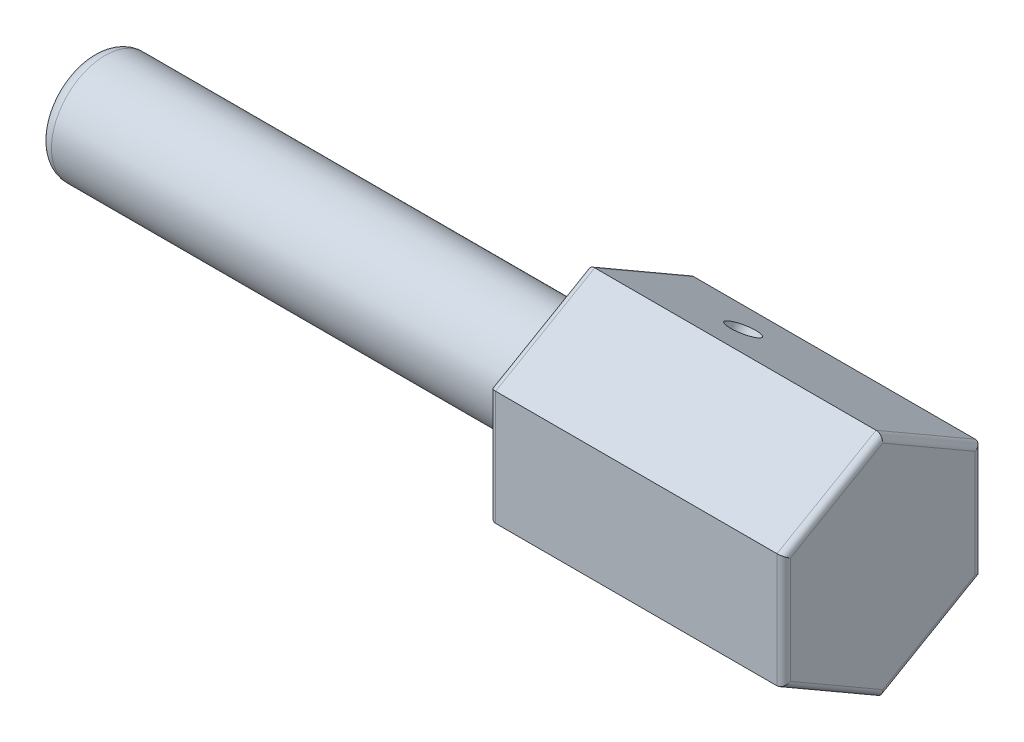
ISO-10303-21;
HEADER;
FILE_DESCRIPTION(('STEP AP214'),'2;1');
FILE_NAME('part.step','',(''),(''),'','','');
FILE_SCHEMA(('AUTOMOTIVE_DESIGN { 1 0 10303 214 1 1 1 1 }'));
ENDSEC;
DATA;
#1=APPLICATION_CONTEXT('core data for automotive mechanical design processes');
#2=APPLICATION_PROTOCOL_DEFINITION('international standard','automotive_design',2000,#1);
#3=PRODUCT_CONTEXT('',#1,'mechanical');
#4=PRODUCT('Part','Part','',(#3));
#5=PRODUCT_RELATED_PRODUCT_CATEGORY('part','',(#4));
#6=PRODUCT_DEFINITION_FORMATION('','',#4);
#7=PRODUCT_DEFINITION_CONTEXT('part definition',#1,'design');
#8=PRODUCT_DEFINITION('design','',#6,#7);
#9=PRODUCT_DEFINITION_SHAPE('','',#8);
#10=(LENGTH_UNIT() NAMED_UNIT(*) SI_UNIT(.MILLI.,.METRE.));
#11=(NAMED_UNIT(*) PLANE_ANGLE_UNIT() SI_UNIT($,.RADIAN.));
#12=(NAMED_UNIT(*) SI_UNIT($,.STERADIAN.) SOLID_ANGLE_UNIT());
#13=UNCERTAINTY_MEASURE_WITH_UNIT(LENGTH_MEASURE(1.E-05),#10,'distance_accuracy_value','');
#14=(GEOMETRIC_REPRESENTATION_CONTEXT(3) GLOBAL_UNCERTAINTY_ASSIGNED_CONTEXT((#13)) GLOBAL_UNIT_ASSIGNED_CONTEXT((#10,
#11,#12)) REPRESENTATION_CONTEXT('',''));
#15=CARTESIAN_POINT('',(0.,0.,0.));
#16=DIRECTION('',(0.,0.,1.));
#17=DIRECTION('',(1.,0.,0.));
#18=AXIS2_PLACEMENT_3D('',#15,#16,#17);
#19=CARTESIAN_POINT('',(37.05,0.,0.));
#20=DIRECTION('',(-1.,0.,0.));
#21=DIRECTION('',(0.,0.,1.));
#22=AXIS2_PLACEMENT_3D('',#19,#20,#21);
#23=CYLINDRICAL_SURFACE('',#22,4.);
#24=CARTESIAN_POINT('',(1.,0.,0.));
#25=DIRECTION('',(1.,0.,0.));
#26=DIRECTION('',(0.,0.,-1.));
#27=AXIS2_PLACEMENT_3D('',#24,#25,#26);
#28=CIRCLE('',#27,4.);
#29=CARTESIAN_POINT('',(1.,0.,-4.));
#30=VERTEX_POINT('',#29);
#31=EDGE_CURVE('E51',#30,#30,#28,.T.);
#32=ORIENTED_EDGE('',*,*,#31,.T.);
#33=EDGE_LOOP('',(#32));
#34=FACE_BOUND('',#33,.T.);
#35=CARTESIAN_POINT('',(36.55,0.,0.));
#36=DIRECTION('',(1.,0.,0.));
#37=DIRECTION('',(0.,0.,-1.));
#38=AXIS2_PLACEMENT_3D('',#35,#36,#37);
#39=CIRCLE('',#38,4.);
#40=CARTESIAN_POINT('',(36.55,0.,-4.));
#41=VERTEX_POINT('',#40);
#42=EDGE_CURVE('E209',#41,#41,#39,.F.);
#43=ORIENTED_EDGE('',*,*,#42,.T.);
#44=EDGE_LOOP('',(#43));
#45=FACE_BOUND('',#44,.T.);
#46=ADVANCED_FACE('F43',(#34,#45),#23,.T.);
#47=CARTESIAN_POINT('',(0.,0.,0.));
#48=DIRECTION('',(1.,0.,0.));
#49=DIRECTION('',(0.,0.,-1.));
#50=AXIS2_PLACEMENT_3D('',#47,#48,#49);
#51=PLANE('',#50);
#52=CARTESIAN_POINT('',(0.,0.,0.));
#53=DIRECTION('',(1.,0.,0.));
#54=DIRECTION('',(0.,0.,-1.));
#55=AXIS2_PLACEMENT_3D('',#52,#53,#54);
#56=CIRCLE('',#55,3.);
#57=CARTESIAN_POINT('',(0.,0.,-3.));
#58=VERTEX_POINT('',#57);
#59=EDGE_CURVE('E11',#58,#58,#56,.F.);
#60=ORIENTED_EDGE('',*,*,#59,.T.);
#61=EDGE_LOOP('',(#60));
#62=FACE_BOUND('',#61,.T.);
#63=ADVANCED_FACE('F268',(#62),#51,.F.);
#64=CARTESIAN_POINT('',(59.05,-4.27239199200323,7.4));
#65=DIRECTION('',(0.,0.866025403784439,-0.5));
#66=DIRECTION('',(0.,0.5,0.866025403784438));
#67=AXIS2_PLACEMENT_3D('',#64,#65,#66);
#68=PLANE('',#67);
#69=CARTESIAN_POINT('',(44.925,-6.40858798800485,3.7));
#70=DIRECTION('',(0.,0.866025403784439,-0.5));
#71=DIRECTION('',(0.,0.5,0.866025403784438));
#72=AXIS2_PLACEMENT_3D('',#69,#70,#71);
#73=CIRCLE('',#72,1.1);
#74=CARTESIAN_POINT('',(44.925,-5.85858798800485,4.65262794416288));
#75=VERTEX_POINT('',#74);
#76=EDGE_CURVE('E241',#75,#75,#73,.T.);
#77=ORIENTED_EDGE('',*,*,#76,.T.);
#78=EDGE_LOOP('',(#77));
#79=FACE_BOUND('',#78,.T.);
#80=DIRECTION('',(-1.,0.,0.));
#81=VECTOR('',#80,1.);
#82=CARTESIAN_POINT('',(59.05,-4.27239199200323,7.4));
#83=LINE('',#82,#81);
#84=CARTESIAN_POINT('',(58.55,-4.27239199200323,7.4));
#85=VERTEX_POINT('',#84);
#86=CARTESIAN_POINT('',(37.55,-4.27239199200323,7.4));
#87=VERTEX_POINT('',#86);
#88=EDGE_CURVE('E237',#85,#87,#83,.T.);
#89=ORIENTED_EDGE('',*,*,#88,.T.);
#90=DIRECTION('',(0.,-0.5,-0.866025403784438));
#91=VECTOR('',#90,1.);
#92=CARTESIAN_POINT('',(37.55,-4.27239199200323,7.4));
#93=LINE('',#92,#91);
#94=CARTESIAN_POINT('',(37.55,-8.54478398400646,0.));
#95=VERTEX_POINT('',#94);
#96=EDGE_CURVE('E207',#87,#95,#93,.T.);
#97=ORIENTED_EDGE('',*,*,#96,.T.);
#98=DIRECTION('',(-1.,0.,0.));
#99=VECTOR('',#98,1.);
#100=CARTESIAN_POINT('',(59.05,-8.54478398400646,0.));
#101=LINE('',#100,#99);
#102=CARTESIAN_POINT('',(58.55,-8.54478398400646,0.));
#103=VERTEX_POINT('',#102);
#104=EDGE_CURVE('E155',#103,#95,#101,.T.);
#105=ORIENTED_EDGE('',*,*,#104,.F.);
#106=DIRECTION('',(0.,-0.5,-0.866025403784438));
#107=VECTOR('',#106,1.);
#108=CARTESIAN_POINT('',(58.55,-4.27239199200323,7.4));
#109=LINE('',#108,#107);
#110=EDGE_CURVE('E205',#103,#85,#109,.F.);
#111=ORIENTED_EDGE('',*,*,#110,.T.);
#112=EDGE_LOOP('',(#89,#97,#105,#111));
#113=FACE_BOUND('',#112,.T.);
#114=ADVANCED_FACE('F272',(#79,#113),#68,.F.);
#115=CARTESIAN_POINT('',(59.05,-8.54478398400646,0.));
#116=DIRECTION('',(0.,0.866025403784439,0.5));
#117=DIRECTION('',(0.,-0.5,0.866025403784439));
#118=AXIS2_PLACEMENT_3D('',#115,#116,#117);
#119=PLANE('',#118);
#120=ORIENTED_EDGE('',*,*,#104,.T.);
#121=DIRECTION('',(0.,0.5,-0.866025403784439));
#122=VECTOR('',#121,1.);
#123=CARTESIAN_POINT('',(37.55,-8.54478398400646,0.));
#124=LINE('',#123,#122);
#125=CARTESIAN_POINT('',(37.55,-4.27239199200323,-7.4));
#126=VERTEX_POINT('',#125);
#127=EDGE_CURVE('E154',#95,#126,#124,.T.);
#128=ORIENTED_EDGE('',*,*,#127,.T.);
#129=DIRECTION('',(-1.,0.,0.));
#130=VECTOR('',#129,1.);
#131=CARTESIAN_POINT('',(59.05,-4.27239199200323,-7.4));
#132=LINE('',#131,#130);
#133=CARTESIAN_POINT('',(58.55,-4.27239199200323,-7.4));
#134=VERTEX_POINT('',#133);
#135=EDGE_CURVE('E136',#134,#126,#132,.T.);
#136=ORIENTED_EDGE('',*,*,#135,.F.);
#137=DIRECTION('',(0.,0.5,-0.866025403784439));
#138=VECTOR('',#137,1.);
#139=CARTESIAN_POINT('',(58.55,-8.54478398400646,0.));
#140=LINE('',#139,#138);
#141=EDGE_CURVE('E151',#134,#103,#140,.F.);
#142=ORIENTED_EDGE('',*,*,#141,.T.);
#143=EDGE_LOOP('',(#120,#128,#136,#142));
#144=FACE_BOUND('',#143,.T.);
#145=ADVANCED_FACE('F149',(#144),#119,.F.);
#146=CARTESIAN_POINT('',(59.05,-4.27239199200323,-7.4));
#147=DIRECTION('',(0.,0.,1.));
#148=DIRECTION('',(0.,-1.,0.));
#149=AXIS2_PLACEMENT_3D('',#146,#147,#148);
#150=PLANE('',#149);
#151=ORIENTED_EDGE('',*,*,#135,.T.);
#152=DIRECTION('',(0.,1.,0.));
#153=VECTOR('',#152,1.);
#154=CARTESIAN_POINT('',(37.55,-4.27239199200323,-7.4));
#155=LINE('',#154,#153);
#156=CARTESIAN_POINT('',(37.55,4.27239199200323,-7.4));
#157=VERTEX_POINT('',#156);
#158=EDGE_CURVE('E143',#126,#157,#155,.T.);
#159=ORIENTED_EDGE('',*,*,#158,.T.);
#160=DIRECTION('',(-1.,0.,0.));
#161=VECTOR('',#160,1.);
#162=CARTESIAN_POINT('',(59.05,4.27239199200323,-7.4));
#163=LINE('',#162,#161);
#164=CARTESIAN_POINT('',(58.55,4.27239199200323,-7.4));
#165=VERTEX_POINT('',#164);
#166=EDGE_CURVE('E138',#165,#157,#163,.T.);
#167=ORIENTED_EDGE('',*,*,#166,.F.);
#168=DIRECTION('',(0.,1.,0.));
#169=VECTOR('',#168,1.);
#170=CARTESIAN_POINT('',(58.55,-4.27239199200323,-7.4));
#171=LINE('',#170,#169);
#172=EDGE_CURVE('E133',#165,#134,#171,.F.);
#173=ORIENTED_EDGE('',*,*,#172,.T.);
#174=EDGE_LOOP('',(#151,#159,#167,#173));
#175=FACE_BOUND('',#174,.T.);
#176=ADVANCED_FACE('F135',(#175),#150,.F.);
#177=CARTESIAN_POINT('',(59.05,4.27239199200323,-7.4));
#178=DIRECTION('',(0.,-0.866025403784439,0.5));
#179=DIRECTION('',(0.,-0.5,-0.866025403784439));
#180=AXIS2_PLACEMENT_3D('',#177,#178,#179);
#181=PLANE('',#180);
#182=CARTESIAN_POINT('',(44.925,6.40858798800485,-3.7));
#183=DIRECTION('',(0.,0.866025403784439,-0.5));
#184=DIRECTION('',(0.,0.5,0.866025403784438));
#185=AXIS2_PLACEMENT_3D('',#182,#183,#184);
#186=CIRCLE('',#185,1.1);
#187=CARTESIAN_POINT('',(44.925,6.95858798800485,-2.74737205583712));
#188=VERTEX_POINT('',#187);
#189=EDGE_CURVE('E517',#188,#188,#186,.T.);
#190=ORIENTED_EDGE('',*,*,#189,.F.);
#191=EDGE_LOOP('',(#190));
#192=FACE_BOUND('',#191,.T.);
#193=ORIENTED_EDGE('',*,*,#166,.T.);
#194=DIRECTION('',(0.,0.5,0.866025403784439));
#195=VECTOR('',#194,1.);
#196=CARTESIAN_POINT('',(37.55,4.27239199200323,-7.4));
#197=LINE('',#196,#195);
#198=CARTESIAN_POINT('',(37.55,8.54478398400646,0.));
#199=VERTEX_POINT('',#198);
#200=EDGE_CURVE('E194',#157,#199,#197,.T.);
#201=ORIENTED_EDGE('',*,*,#200,.T.);
#202=DIRECTION('',(-1.,0.,0.));
#203=VECTOR('',#202,1.);
#204=CARTESIAN_POINT('',(59.05,8.54478398400646,0.));
#205=LINE('',#204,#203);
#206=CARTESIAN_POINT('',(58.55,8.54478398400646,0.));
#207=VERTEX_POINT('',#206);
#208=EDGE_CURVE('E498',#207,#199,#205,.T.);
#209=ORIENTED_EDGE('',*,*,#208,.F.);
#210=DIRECTION('',(0.,0.5,0.866025403784439));
#211=VECTOR('',#210,1.);
#212=CARTESIAN_POINT('',(58.55,4.27239199200323,-7.4));
#213=LINE('',#212,#211);
#214=EDGE_CURVE('E192',#207,#165,#213,.F.);
#215=ORIENTED_EDGE('',*,*,#214,.T.);
#216=EDGE_LOOP('',(#193,#201,#209,#215));
#217=FACE_BOUND('',#216,.T.);
#218=ADVANCED_FACE('F363',(#192,#217),#181,.F.);
#219=CARTESIAN_POINT('',(59.05,8.54478398400646,0.));
#220=DIRECTION('',(0.,-0.866025403784439,-0.5));
#221=DIRECTION('',(0.,0.5,-0.866025403784439));
#222=AXIS2_PLACEMENT_3D('',#219,#220,#221);
#223=PLANE('',#222);
#224=ORIENTED_EDGE('',*,*,#208,.T.);
#225=DIRECTION('',(0.,-0.5,0.866025403784439));
#226=VECTOR('',#225,1.);
#227=CARTESIAN_POINT('',(37.55,8.54478398400646,0.));
#228=LINE('',#227,#226);
#229=CARTESIAN_POINT('',(37.55,4.27239199200323,7.4));
#230=VERTEX_POINT('',#229);
#231=EDGE_CURVE('E198',#199,#230,#228,.T.);
#232=ORIENTED_EDGE('',*,*,#231,.T.);
#233=DIRECTION('',(-1.,0.,0.));
#234=VECTOR('',#233,1.);
#235=CARTESIAN_POINT('',(59.05,4.27239199200323,7.4));
#236=LINE('',#235,#234);
#237=CARTESIAN_POINT('',(58.55,4.27239199200323,7.4));
#238=VERTEX_POINT('',#237);
#239=EDGE_CURVE('E507',#238,#230,#236,.T.);
#240=ORIENTED_EDGE('',*,*,#239,.F.);
#241=DIRECTION('',(0.,-0.5,0.866025403784439));
#242=VECTOR('',#241,1.);
#243=CARTESIAN_POINT('',(58.55,8.54478398400646,0.));
#244=LINE('',#243,#242);
#245=EDGE_CURVE('E196',#238,#207,#244,.F.);
#246=ORIENTED_EDGE('',*,*,#245,.T.);
#247=EDGE_LOOP('',(#224,#232,#240,#246));
#248=FACE_BOUND('',#247,.T.);
#249=ADVANCED_FACE('F366',(#248),#223,.F.);
#250=CARTESIAN_POINT('',(59.05,4.27239199200323,7.4));
#251=DIRECTION('',(0.,0.,-1.));
#252=DIRECTION('',(-1.,0.,0.));
#253=AXIS2_PLACEMENT_3D('',#250,#251,#252);
#254=PLANE('',#253);
#255=ORIENTED_EDGE('',*,*,#239,.T.);
#256=DIRECTION('',(0.,-1.,0.));
#257=VECTOR('',#256,1.);
#258=CARTESIAN_POINT('',(37.55,4.27239199200323,7.4));
#259=LINE('',#258,#257);
#260=EDGE_CURVE('E203',#230,#87,#259,.T.);
#261=ORIENTED_EDGE('',*,*,#260,.T.);
#262=ORIENTED_EDGE('',*,*,#88,.F.);
#263=DIRECTION('',(0.,-1.,0.));
#264=VECTOR('',#263,1.);
#265=CARTESIAN_POINT('',(58.55,4.27239199200323,7.4));
#266=LINE('',#265,#264);
#267=EDGE_CURVE('E200',#85,#238,#266,.F.);
#268=ORIENTED_EDGE('',*,*,#267,.T.);
#269=EDGE_LOOP('',(#255,#261,#262,#268));
#270=FACE_BOUND('',#269,.T.);
#271=ADVANCED_FACE('F403',(#270),#254,.F.);
#272=CARTESIAN_POINT('',(59.05,0.,0.));
#273=DIRECTION('',(1.,0.,0.));
#274=DIRECTION('',(0.,0.,-1.));
#275=AXIS2_PLACEMENT_3D('',#272,#273,#274);
#276=PLANE('',#275);
#277=DIRECTION('',(0.,-0.5,0.866025403784439));
#278=VECTOR('',#277,1.);
#279=CARTESIAN_POINT('',(59.05,3.83937929011101,7.15));
#280=LINE('',#279,#278);
#281=CARTESIAN_POINT('',(59.05,7.96743371481684,0.));
#282=VERTEX_POINT('',#281);
#283=CARTESIAN_POINT('',(59.05,3.98371685740842,6.9));
#284=VERTEX_POINT('',#283);
#285=EDGE_CURVE('E58',#282,#284,#280,.T.);
#286=ORIENTED_EDGE('',*,*,#285,.T.);
#287=DIRECTION('',(0.,-1.,0.));
#288=VECTOR('',#287,1.);
#289=CARTESIAN_POINT('',(59.05,-4.27239199200323,6.9));
#290=LINE('',#289,#288);
#291=CARTESIAN_POINT('',(59.05,-3.98371685740842,6.9));
#292=VERTEX_POINT('',#291);
#293=EDGE_CURVE('E219',#284,#292,#290,.T.);
#294=ORIENTED_EDGE('',*,*,#293,.T.);
#295=DIRECTION('',(0.,-0.5,-0.866025403784438));
#296=VECTOR('',#295,1.);
#297=CARTESIAN_POINT('',(59.05,-8.11177128211425,-0.249999999999997));
#298=LINE('',#297,#296);
#299=CARTESIAN_POINT('',(59.05,-7.96743371481684,0.));
#300=VERTEX_POINT('',#299);
#301=EDGE_CURVE('E212',#292,#300,#298,.T.);
#302=ORIENTED_EDGE('',*,*,#301,.T.);
#303=DIRECTION('',(0.,0.5,-0.866025403784439));
#304=VECTOR('',#303,1.);
#305=CARTESIAN_POINT('',(59.05,-3.83937929011101,-7.15));
#306=LINE('',#305,#304);
#307=CARTESIAN_POINT('',(59.05,-3.98371685740842,-6.9));
#308=VERTEX_POINT('',#307);
#309=EDGE_CURVE('E214',#300,#308,#306,.T.);
#310=ORIENTED_EDGE('',*,*,#309,.T.);
#311=DIRECTION('',(0.,1.,0.));
#312=VECTOR('',#311,1.);
#313=CARTESIAN_POINT('',(59.05,4.27239199200323,-6.9));
#314=LINE('',#313,#312);
#315=CARTESIAN_POINT('',(59.05,3.98371685740842,-6.9));
#316=VERTEX_POINT('',#315);
#317=EDGE_CURVE('E161',#308,#316,#314,.T.);
#318=ORIENTED_EDGE('',*,*,#317,.T.);
#319=DIRECTION('',(0.,0.5,0.866025403784439));
#320=VECTOR('',#319,1.);
#321=CARTESIAN_POINT('',(59.05,8.11177128211425,0.249999999999998));
#322=LINE('',#321,#320);
#323=EDGE_CURVE('E63',#316,#282,#322,.T.);
#324=ORIENTED_EDGE('',*,*,#323,.T.);
#325=EDGE_LOOP('',(#286,#294,#302,#310,#318,#324));
#326=FACE_BOUND('',#325,.T.);
#327=ADVANCED_FACE('F412',(#326),#276,.T.);
#328=CARTESIAN_POINT('',(37.05,0.,0.));
#329=DIRECTION('',(1.,0.,0.));
#330=DIRECTION('',(0.,0.,-1.));
#331=AXIS2_PLACEMENT_3D('',#328,#329,#330);
#332=PLANE('',#331);
#333=DIRECTION('',(0.,1.,0.));
#334=VECTOR('',#333,1.);
#335=CARTESIAN_POINT('',(37.05,0.,-6.9));
#336=LINE('',#335,#334);
#337=CARTESIAN_POINT('',(37.05,3.98371685740842,-6.9));
#338=VERTEX_POINT('',#337);
#339=CARTESIAN_POINT('',(37.05,-3.98371685740842,-6.9));
#340=VERTEX_POINT('',#339);
#341=EDGE_CURVE('E187',#338,#340,#336,.F.);
#342=ORIENTED_EDGE('',*,*,#341,.T.);
#343=DIRECTION('',(0.,0.5,-0.866025403784439));
#344=VECTOR('',#343,1.);
#345=CARTESIAN_POINT('',(37.05,-5.97557528611263,-3.45));
#346=LINE('',#345,#344);
#347=CARTESIAN_POINT('',(37.05,-7.96743371481684,0.));
#348=VERTEX_POINT('',#347);
#349=EDGE_CURVE('E144',#340,#348,#346,.F.);
#350=ORIENTED_EDGE('',*,*,#349,.T.);
#351=DIRECTION('',(0.,-0.5,-0.866025403784438));
#352=VECTOR('',#351,1.);
#353=CARTESIAN_POINT('',(37.05,-5.97557528611263,3.45));
#354=LINE('',#353,#352);
#355=CARTESIAN_POINT('',(37.05,-3.98371685740842,6.9));
#356=VERTEX_POINT('',#355);
#357=EDGE_CURVE('E179',#348,#356,#354,.F.);
#358=ORIENTED_EDGE('',*,*,#357,.T.);
#359=DIRECTION('',(0.,-1.,0.));
#360=VECTOR('',#359,1.);
#361=CARTESIAN_POINT('',(37.05,0.,6.9));
#362=LINE('',#361,#360);
#363=CARTESIAN_POINT('',(37.05,3.98371685740842,6.9));
#364=VERTEX_POINT('',#363);
#365=EDGE_CURVE('E181',#356,#364,#362,.F.);
#366=ORIENTED_EDGE('',*,*,#365,.T.);
#367=DIRECTION('',(0.,-0.5,0.866025403784439));
#368=VECTOR('',#367,1.);
#369=CARTESIAN_POINT('',(37.05,5.97557528611263,3.45));
#370=LINE('',#369,#368);
#371=CARTESIAN_POINT('',(37.05,7.96743371481684,0.));
#372=VERTEX_POINT('',#371);
#373=EDGE_CURVE('E183',#364,#372,#370,.F.);
#374=ORIENTED_EDGE('',*,*,#373,.T.);
#375=DIRECTION('',(0.,0.5,0.866025403784439));
#376=VECTOR('',#375,1.);
#377=CARTESIAN_POINT('',(37.05,5.97557528611263,-3.45));
#378=LINE('',#377,#376);
#379=EDGE_CURVE('E185',#372,#338,#378,.F.);
#380=ORIENTED_EDGE('',*,*,#379,.T.);
#381=EDGE_LOOP('',(#342,#350,#358,#366,#374,#380));
#382=FACE_BOUND('',#381,.T.);
#383=CARTESIAN_POINT('',(37.05,0.,0.));
#384=DIRECTION('',(1.,0.,0.));
#385=DIRECTION('',(0.,0.,-1.));
#386=AXIS2_PLACEMENT_3D('',#383,#384,#385);
#387=CIRCLE('',#386,4.5);
#388=CARTESIAN_POINT('',(37.05,0.,-4.5));
#389=VERTEX_POINT('',#388);
#390=EDGE_CURVE('E173',#389,#389,#387,.T.);
#391=ORIENTED_EDGE('',*,*,#390,.T.);
#392=EDGE_LOOP('',(#391));
#393=FACE_BOUND('',#392,.T.);
#394=ADVANCED_FACE('F301',(#382,#393),#332,.F.);
#395=CARTESIAN_POINT('',(37.55,8.11177128211424,-0.250000000000002));
#396=DIRECTION('',(0.,-0.5,0.866025403784439));
#397=DIRECTION('',(0.,-0.866025403784439,-0.5));
#398=AXIS2_PLACEMENT_3D('',#395,#396,#397);
#399=CYLINDRICAL_SURFACE('',#398,0.5);
#400=CARTESIAN_POINT('',(37.55,7.96743371481684,0.));
#401=DIRECTION('',(0.,0.,1.));
#402=DIRECTION('',(0.,-1.,0.));
#403=AXIS2_PLACEMENT_3D('',#400,#401,#402);
#404=ELLIPSE('',#403,0.577350269189626,0.5);
#405=EDGE_CURVE('E231',#372,#199,#404,.F.);
#406=ORIENTED_EDGE('',*,*,#405,.F.);
#407=ORIENTED_EDGE('',*,*,#373,.F.);
#408=CARTESIAN_POINT('',(37.55,3.98371685740842,6.9));
#409=DIRECTION('',(0.,-0.866025403784439,0.5));
#410=DIRECTION('',(0.,-0.5,-0.866025403784439));
#411=AXIS2_PLACEMENT_3D('',#408,#409,#410);
#412=ELLIPSE('',#411,0.577350269189626,0.5);
#413=EDGE_CURVE('E234',#230,#364,#412,.T.);
#414=ORIENTED_EDGE('',*,*,#413,.F.);
#415=ORIENTED_EDGE('',*,*,#231,.F.);
#416=EDGE_LOOP('',(#406,#407,#414,#415));
#417=FACE_BOUND('',#416,.T.);
#418=ADVANCED_FACE('F297',(#417),#399,.T.);
#419=CARTESIAN_POINT('',(37.55,4.27239199200323,6.9));
#420=DIRECTION('',(0.,-1.,0.));
#421=DIRECTION('',(0.,0.,-1.));
#422=AXIS2_PLACEMENT_3D('',#419,#420,#421);
#423=CYLINDRICAL_SURFACE('',#422,0.5);
#424=ORIENTED_EDGE('',*,*,#413,.T.);
#425=ORIENTED_EDGE('',*,*,#365,.F.);
#426=CARTESIAN_POINT('',(37.55,-3.98371685740842,6.9));
#427=DIRECTION('',(0.,-0.866025403784439,-0.5));
#428=DIRECTION('',(0.,0.5,-0.866025403784439));
#429=AXIS2_PLACEMENT_3D('',#426,#427,#428);
#430=ELLIPSE('',#429,0.577350269189626,0.5);
#431=EDGE_CURVE('E228',#87,#356,#430,.T.);
#432=ORIENTED_EDGE('',*,*,#431,.F.);
#433=ORIENTED_EDGE('',*,*,#260,.F.);
#434=EDGE_LOOP('',(#424,#425,#432,#433));
#435=FACE_BOUND('',#434,.T.);
#436=ADVANCED_FACE('F293',(#435),#423,.T.);
#437=CARTESIAN_POINT('',(37.55,3.83937929011101,-7.15));
#438=DIRECTION('',(0.,0.5,0.866025403784439));
#439=DIRECTION('',(0.,-0.866025403784439,0.5));
#440=AXIS2_PLACEMENT_3D('',#437,#438,#439);
#441=CYLINDRICAL_SURFACE('',#440,0.5);
#442=ORIENTED_EDGE('',*,*,#405,.T.);
#443=ORIENTED_EDGE('',*,*,#200,.F.);
#444=CARTESIAN_POINT('',(37.55,3.98371685740842,-6.9));
#445=DIRECTION('',(0.,0.866025403784439,0.5));
#446=DIRECTION('',(0.,-0.5,0.866025403784439));
#447=AXIS2_PLACEMENT_3D('',#444,#445,#446);
#448=ELLIPSE('',#447,0.577350269189626,0.5);
#449=EDGE_CURVE('E225',#338,#157,#448,.F.);
#450=ORIENTED_EDGE('',*,*,#449,.F.);
#451=ORIENTED_EDGE('',*,*,#379,.F.);
#452=EDGE_LOOP('',(#442,#443,#450,#451));
#453=FACE_BOUND('',#452,.T.);
#454=ADVANCED_FACE('F289',(#453),#441,.T.);
#455=CARTESIAN_POINT('',(37.55,-3.83937929011101,7.15));
#456=DIRECTION('',(0.,-0.5,-0.866025403784438));
#457=DIRECTION('',(0.,0.866025403784439,-0.5));
#458=AXIS2_PLACEMENT_3D('',#455,#456,#457);
#459=CYLINDRICAL_SURFACE('',#458,0.5);
#460=ORIENTED_EDGE('',*,*,#431,.T.);
#461=ORIENTED_EDGE('',*,*,#357,.F.);
#462=CARTESIAN_POINT('',(37.55,-7.96743371481684,0.));
#463=DIRECTION('',(0.,0.,-1.));
#464=DIRECTION('',(0.,-1.,0.));
#465=AXIS2_PLACEMENT_3D('',#462,#463,#464);
#466=ELLIPSE('',#465,0.577350269189626,0.5);
#467=EDGE_CURVE('E223',#95,#348,#466,.T.);
#468=ORIENTED_EDGE('',*,*,#467,.F.);
#469=ORIENTED_EDGE('',*,*,#96,.F.);
#470=EDGE_LOOP('',(#460,#461,#468,#469));
#471=FACE_BOUND('',#470,.T.);
#472=ADVANCED_FACE('F285',(#471),#459,.T.);
#473=CARTESIAN_POINT('',(37.55,-4.27239199200323,-6.9));
#474=DIRECTION('',(0.,1.,0.));
#475=DIRECTION('',(0.,0.,1.));
#476=AXIS2_PLACEMENT_3D('',#473,#474,#475);
#477=CYLINDRICAL_SURFACE('',#476,0.5);
#478=ORIENTED_EDGE('',*,*,#449,.T.);
#479=ORIENTED_EDGE('',*,*,#158,.F.);
#480=CARTESIAN_POINT('',(37.55,-3.98371685740842,-6.9));
#481=DIRECTION('',(0.,0.866025403784439,-0.5));
#482=DIRECTION('',(0.,0.5,0.866025403784439));
#483=AXIS2_PLACEMENT_3D('',#480,#481,#482);
#484=ELLIPSE('',#483,0.577350269189626,0.5);
#485=EDGE_CURVE('E221',#340,#126,#484,.F.);
#486=ORIENTED_EDGE('',*,*,#485,.F.);
#487=ORIENTED_EDGE('',*,*,#341,.F.);
#488=EDGE_LOOP('',(#478,#479,#486,#487));
#489=FACE_BOUND('',#488,.T.);
#490=ADVANCED_FACE('F281',(#489),#477,.T.);
#491=CARTESIAN_POINT('',(37.55,-8.11177128211424,0.250000000000002));
#492=DIRECTION('',(0.,0.5,-0.866025403784439));
#493=DIRECTION('',(0.,0.866025403784439,0.5));
#494=AXIS2_PLACEMENT_3D('',#491,#492,#493);
#495=CYLINDRICAL_SURFACE('',#494,0.5);
#496=ORIENTED_EDGE('',*,*,#467,.T.);
#497=ORIENTED_EDGE('',*,*,#349,.F.);
#498=ORIENTED_EDGE('',*,*,#485,.T.);
#499=ORIENTED_EDGE('',*,*,#127,.F.);
#500=EDGE_LOOP('',(#496,#497,#498,#499));
#501=FACE_BOUND('',#500,.T.);
#502=ADVANCED_FACE('F277',(#501),#495,.T.);
#503=CARTESIAN_POINT('',(36.55,0.,0.));
#504=DIRECTION('',(1.,0.,0.));
#505=DIRECTION('',(0.,0.,-1.));
#506=AXIS2_PLACEMENT_3D('',#503,#504,#505);
#507=TOROIDAL_SURFACE('',#506,4.5,0.5);
#508=ORIENTED_EDGE('',*,*,#42,.F.);
#509=EDGE_LOOP('',(#508));
#510=FACE_BOUND('',#509,.T.);
#511=ORIENTED_EDGE('',*,*,#390,.F.);
#512=EDGE_LOOP('',(#511));
#513=FACE_BOUND('',#512,.T.);
#514=ADVANCED_FACE('F280',(#510,#513),#507,.F.);
#515=CARTESIAN_POINT('',(58.55,0.,-6.9));
#516=DIRECTION('',(0.,-1.,0.));
#517=DIRECTION('',(0.,0.,-1.));
#518=AXIS2_PLACEMENT_3D('',#515,#516,#517);
#519=CYLINDRICAL_SURFACE('',#518,0.5);
#520=CARTESIAN_POINT('',(58.55,-3.98371685740842,-6.9));
#521=DIRECTION('',(0.,-0.866025403784439,0.5));
#522=DIRECTION('',(0.,0.5,0.866025403784439));
#523=AXIS2_PLACEMENT_3D('',#520,#521,#522);
#524=ELLIPSE('',#523,0.577350269189626,0.5);
#525=EDGE_CURVE('E159',#134,#308,#524,.T.);
#526=ORIENTED_EDGE('',*,*,#525,.F.);
#527=ORIENTED_EDGE('',*,*,#172,.F.);
#528=CARTESIAN_POINT('',(58.55,3.98371685740842,-6.9));
#529=DIRECTION('',(0.,-0.866025403784439,-0.5));
#530=DIRECTION('',(0.,-0.5,0.866025403784439));
#531=AXIS2_PLACEMENT_3D('',#528,#529,#530);
#532=ELLIPSE('',#531,0.577350269189626,0.5);
#533=EDGE_CURVE('E164',#316,#165,#532,.F.);
#534=ORIENTED_EDGE('',*,*,#533,.F.);
#535=ORIENTED_EDGE('',*,*,#317,.F.);
#536=EDGE_LOOP('',(#526,#527,#534,#535));
#537=FACE_BOUND('',#536,.T.);
#538=ADVANCED_FACE('F160',(#537),#519,.T.);
#539=CARTESIAN_POINT('',(58.55,5.97557528611263,-3.45));
#540=DIRECTION('',(0.,-0.5,-0.866025403784439));
#541=DIRECTION('',(0.,0.866025403784439,-0.5));
#542=AXIS2_PLACEMENT_3D('',#539,#540,#541);
#543=CYLINDRICAL_SURFACE('',#542,0.5);
#544=ORIENTED_EDGE('',*,*,#533,.T.);
#545=ORIENTED_EDGE('',*,*,#214,.F.);
#546=CARTESIAN_POINT('',(58.55,7.96743371481684,0.));
#547=DIRECTION('',(0.,0.,-1.));
#548=DIRECTION('',(0.,-1.,0.));
#549=AXIS2_PLACEMENT_3D('',#546,#547,#548);
#550=ELLIPSE('',#549,0.577350269189626,0.5);
#551=EDGE_CURVE('E165',#282,#207,#550,.F.);
#552=ORIENTED_EDGE('',*,*,#551,.F.);
#553=ORIENTED_EDGE('',*,*,#323,.F.);
#554=EDGE_LOOP('',(#544,#545,#552,#553));
#555=FACE_BOUND('',#554,.T.);
#556=ADVANCED_FACE('F315',(#555),#543,.T.);
#557=CARTESIAN_POINT('',(58.55,-5.97557528611263,-3.45));
#558=DIRECTION('',(0.,-0.5,0.866025403784439));
#559=DIRECTION('',(0.,-0.866025403784439,-0.5));
#560=AXIS2_PLACEMENT_3D('',#557,#558,#559);
#561=CYLINDRICAL_SURFACE('',#560,0.5);
#562=ORIENTED_EDGE('',*,*,#525,.T.);
#563=ORIENTED_EDGE('',*,*,#309,.F.);
#564=CARTESIAN_POINT('',(58.55,-7.96743371481684,0.));
#565=DIRECTION('',(0.,0.,1.));
#566=DIRECTION('',(0.,1.,0.));
#567=AXIS2_PLACEMENT_3D('',#564,#565,#566);
#568=ELLIPSE('',#567,0.577350269189626,0.5);
#569=EDGE_CURVE('E170',#103,#300,#568,.T.);
#570=ORIENTED_EDGE('',*,*,#569,.F.);
#571=ORIENTED_EDGE('',*,*,#141,.F.);
#572=EDGE_LOOP('',(#562,#563,#570,#571));
#573=FACE_BOUND('',#572,.T.);
#574=ADVANCED_FACE('F168',(#573),#561,.T.);
#575=CARTESIAN_POINT('',(58.55,5.97557528611263,3.45));
#576=DIRECTION('',(0.,0.5,-0.866025403784439));
#577=DIRECTION('',(0.,0.866025403784439,0.5));
#578=AXIS2_PLACEMENT_3D('',#575,#576,#577);
#579=CYLINDRICAL_SURFACE('',#578,0.5);
#580=ORIENTED_EDGE('',*,*,#551,.T.);
#581=ORIENTED_EDGE('',*,*,#245,.F.);
#582=CARTESIAN_POINT('',(58.55,3.98371685740842,6.9));
#583=DIRECTION('',(0.,0.866025403784439,-0.5));
#584=DIRECTION('',(0.,-0.5,-0.866025403784439));
#585=AXIS2_PLACEMENT_3D('',#582,#583,#584);
#586=ELLIPSE('',#585,0.577350269189626,0.5);
#587=EDGE_CURVE('E240',#284,#238,#586,.F.);
#588=ORIENTED_EDGE('',*,*,#587,.F.);
#589=ORIENTED_EDGE('',*,*,#285,.F.);
#590=EDGE_LOOP('',(#580,#581,#588,#589));
#591=FACE_BOUND('',#590,.T.);
#592=ADVANCED_FACE('F308',(#591),#579,.T.);
#593=CARTESIAN_POINT('',(58.55,-5.97557528611263,3.45));
#594=DIRECTION('',(0.,0.5,0.866025403784438));
#595=DIRECTION('',(0.,-0.866025403784439,0.5));
#596=AXIS2_PLACEMENT_3D('',#593,#594,#595);
#597=CYLINDRICAL_SURFACE('',#596,0.5);
#598=ORIENTED_EDGE('',*,*,#569,.T.);
#599=ORIENTED_EDGE('',*,*,#301,.F.);
#600=CARTESIAN_POINT('',(58.55,-3.98371685740842,6.9));
#601=DIRECTION('',(0.,0.866025403784439,0.5));
#602=DIRECTION('',(0.,-0.5,0.866025403784439));
#603=AXIS2_PLACEMENT_3D('',#600,#601,#602);
#604=ELLIPSE('',#603,0.577350269189626,0.5);
#605=EDGE_CURVE('E238',#85,#292,#604,.T.);
#606=ORIENTED_EDGE('',*,*,#605,.F.);
#607=ORIENTED_EDGE('',*,*,#110,.F.);
#608=EDGE_LOOP('',(#598,#599,#606,#607));
#609=FACE_BOUND('',#608,.T.);
#610=ADVANCED_FACE('F263',(#609),#597,.T.);
#611=CARTESIAN_POINT('',(58.55,0.,6.9));
#612=DIRECTION('',(0.,1.,0.));
#613=DIRECTION('',(0.,0.,1.));
#614=AXIS2_PLACEMENT_3D('',#611,#612,#613);
#615=CYLINDRICAL_SURFACE('',#614,0.5);
#616=ORIENTED_EDGE('',*,*,#587,.T.);
#617=ORIENTED_EDGE('',*,*,#267,.F.);
#618=ORIENTED_EDGE('',*,*,#605,.T.);
#619=ORIENTED_EDGE('',*,*,#293,.F.);
#620=EDGE_LOOP('',(#616,#617,#618,#619));
#621=FACE_BOUND('',#620,.T.);
#622=ADVANCED_FACE('F253',(#621),#615,.T.);
#623=CARTESIAN_POINT('',(1.,0.,0.));
#624=DIRECTION('',(1.,0.,0.));
#625=DIRECTION('',(0.,0.,-1.));
#626=AXIS2_PLACEMENT_3D('',#623,#624,#625);
#627=TOROIDAL_SURFACE('',#626,3.,1.);
#628=ORIENTED_EDGE('',*,*,#59,.F.);
#629=EDGE_LOOP('',(#628));
#630=FACE_BOUND('',#629,.T.);
#631=ORIENTED_EDGE('',*,*,#31,.F.);
#632=EDGE_LOOP('',(#631));
#633=FACE_BOUND('',#632,.T.);
#634=ADVANCED_FACE('F45',(#630,#633),#627,.T.);
#635=CARTESIAN_POINT('',(44.925,-10.9119200876839,6.3));
#636=DIRECTION('',(0.,0.866025403784438,-0.5));
#637=DIRECTION('',(0.,0.5,0.866025403784438));
#638=AXIS2_PLACEMENT_3D('',#635,#636,#637);
#639=CYLINDRICAL_SURFACE('',#638,1.1);
#640=ORIENTED_EDGE('',*,*,#189,.T.);
#641=EDGE_LOOP('',(#640));
#642=FACE_BOUND('',#641,.T.);
#643=ORIENTED_EDGE('',*,*,#76,.F.);
#644=EDGE_LOOP('',(#643));
#645=FACE_BOUND('',#644,.T.);
#646=ADVANCED_FACE('F252',(#642,#645),#639,.F.);
#647=CLOSED_SHELL('',(#46,#63,#114,#145,#176,#218,#249,#271,#327,#394,#418,#436,#454,#472,#490,
#502,#514,#538,#556,#574,#592,#610,#622,#634,#646));
#648=MANIFOLD_SOLID_BREP('B2',#647);
#649=ADVANCED_BREP_SHAPE_REPRESENTATION('',(#18,#648),#14);
#650=SHAPE_DEFINITION_REPRESENTATION(#9,#649);
ENDSEC;
END-ISO-10303-21;
